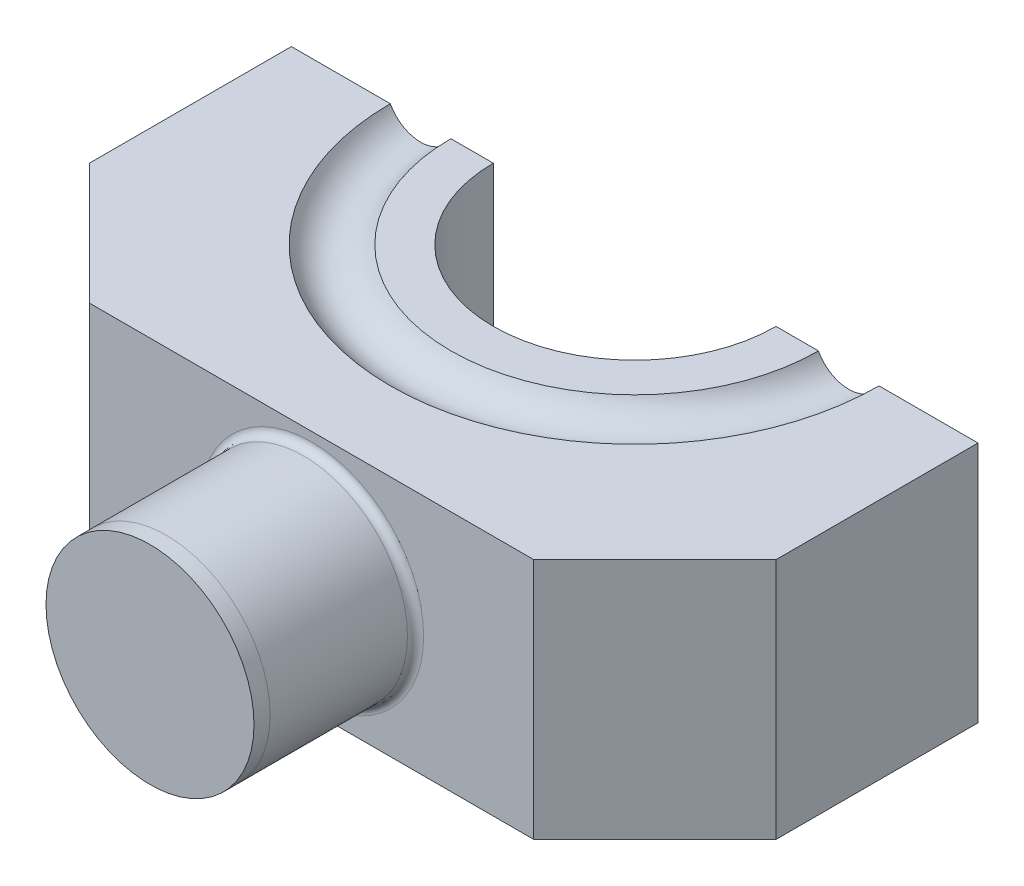
ISO-10303-21;
HEADER;
FILE_DESCRIPTION(('STEP AP214'),'2;1');
FILE_NAME('part.step','',(''),(''),'','','');
FILE_SCHEMA(('AUTOMOTIVE_DESIGN { 1 0 10303 214 1 1 1 1 }'));
ENDSEC;
DATA;
#1=APPLICATION_CONTEXT('core data for automotive mechanical design processes');
#2=APPLICATION_PROTOCOL_DEFINITION('international standard','automotive_design',2000,#1);
#3=PRODUCT_CONTEXT('',#1,'mechanical');
#4=PRODUCT('Part','Part','',(#3));
#5=PRODUCT_RELATED_PRODUCT_CATEGORY('part','',(#4));
#6=PRODUCT_DEFINITION_FORMATION('','',#4);
#7=PRODUCT_DEFINITION_CONTEXT('part definition',#1,'design');
#8=PRODUCT_DEFINITION('design','',#6,#7);
#9=PRODUCT_DEFINITION_SHAPE('','',#8);
#10=(LENGTH_UNIT() NAMED_UNIT(*) SI_UNIT(.MILLI.,.METRE.));
#11=(NAMED_UNIT(*) PLANE_ANGLE_UNIT() SI_UNIT($,.RADIAN.));
#12=(NAMED_UNIT(*) SI_UNIT($,.STERADIAN.) SOLID_ANGLE_UNIT());
#13=UNCERTAINTY_MEASURE_WITH_UNIT(LENGTH_MEASURE(1.E-05),#10,'distance_accuracy_value','');
#14=(GEOMETRIC_REPRESENTATION_CONTEXT(3) GLOBAL_UNCERTAINTY_ASSIGNED_CONTEXT((#13)) GLOBAL_UNIT_ASSIGNED_CONTEXT((#10,
#11,#12)) REPRESENTATION_CONTEXT('',''));
#15=CARTESIAN_POINT('',(0.,0.,0.));
#16=DIRECTION('',(0.,0.,1.));
#17=DIRECTION('',(1.,0.,0.));
#18=AXIS2_PLACEMENT_3D('',#15,#16,#17);
#19=CARTESIAN_POINT('',(0.,60.,240.));
#20=DIRECTION('',(0.,0.,-1.));
#21=DIRECTION('',(-1.,0.,0.));
#22=AXIS2_PLACEMENT_3D('',#19,#20,#21);
#23=CYLINDRICAL_SURFACE('',#22,51.5);
#24=CARTESIAN_POINT('',(0.,60.,164.));
#25=DIRECTION('',(0.,0.,-1.));
#26=DIRECTION('',(-1.,0.,0.));
#27=AXIS2_PLACEMENT_3D('',#24,#25,#26);
#28=CIRCLE('',#27,51.5);
#29=CARTESIAN_POINT('',(-51.5,60.,164.));
#30=VERTEX_POINT('',#29);
#31=EDGE_CURVE('E186',#30,#30,#28,.F.);
#32=ORIENTED_EDGE('',*,*,#31,.T.);
#33=EDGE_LOOP('',(#32));
#34=FACE_BOUND('',#33,.T.);
#35=CARTESIAN_POINT('',(0.,60.,232.));
#36=DIRECTION('',(0.,0.,1.));
#37=DIRECTION('',(1.,0.,0.));
#38=AXIS2_PLACEMENT_3D('',#35,#36,#37);
#39=CIRCLE('',#38,51.5);
#40=CARTESIAN_POINT('',(51.5,60.,232.));
#41=VERTEX_POINT('',#40);
#42=EDGE_CURVE('E11',#41,#41,#39,.F.);
#43=ORIENTED_EDGE('',*,*,#42,.T.);
#44=EDGE_LOOP('',(#43));
#45=FACE_BOUND('',#44,.T.);
#46=ADVANCED_FACE('F41',(#34,#45),#23,.T.);
#47=CARTESIAN_POINT('',(0.,120.,0.));
#48=DIRECTION('',(0.,1.,0.));
#49=DIRECTION('',(0.,0.,1.));
#50=AXIS2_PLACEMENT_3D('',#47,#48,#49);
#51=PLANE('',#50);
#52=DIRECTION('',(1.,0.,0.));
#53=VECTOR('',#52,1.);
#54=CARTESIAN_POINT('',(231.262306932653,120.,0.));
#55=LINE('',#54,#53);
#56=CARTESIAN_POINT('',(-170.,120.,0.));
#57=VERTEX_POINT('',#56);
#58=CARTESIAN_POINT('',(-121.,120.,0.));
#59=VERTEX_POINT('',#58);
#60=EDGE_CURVE('E65',#57,#59,#55,.T.);
#61=ORIENTED_EDGE('',*,*,#60,.F.);
#62=DIRECTION('',(0.,0.,1.));
#63=VECTOR('',#62,1.);
#64=CARTESIAN_POINT('',(-170.,120.,-100.000000000001));
#65=LINE('',#64,#63);
#66=CARTESIAN_POINT('',(-170.,120.,100.000000000001));
#67=VERTEX_POINT('',#66);
#68=EDGE_CURVE('E135',#57,#67,#65,.T.);
#69=ORIENTED_EDGE('',*,*,#68,.T.);
#70=DIRECTION('',(0.707106781186552,0.,0.707106781186544));
#71=VECTOR('',#70,1.);
#72=CARTESIAN_POINT('',(-110.,120.,160.));
#73=LINE('',#72,#71);
#74=CARTESIAN_POINT('',(-110.,120.,160.));
#75=VERTEX_POINT('',#74);
#76=EDGE_CURVE('E148',#67,#75,#73,.T.);
#77=ORIENTED_EDGE('',*,*,#76,.T.);
#78=DIRECTION('',(1.,0.,0.));
#79=VECTOR('',#78,1.);
#80=CARTESIAN_POINT('',(-110.,120.,160.));
#81=LINE('',#80,#79);
#82=CARTESIAN_POINT('',(110.,120.,160.));
#83=VERTEX_POINT('',#82);
#84=EDGE_CURVE('E151',#75,#83,#81,.T.);
#85=ORIENTED_EDGE('',*,*,#84,.T.);
#86=DIRECTION('',(0.707106781186551,0.,-0.707106781186544));
#87=VECTOR('',#86,1.);
#88=CARTESIAN_POINT('',(110.,120.,160.));
#89=LINE('',#88,#87);
#90=CARTESIAN_POINT('',(170.,120.,100.000000000001));
#91=VERTEX_POINT('',#90);
#92=EDGE_CURVE('E161',#83,#91,#89,.T.);
#93=ORIENTED_EDGE('',*,*,#92,.T.);
#94=DIRECTION('',(0.,0.,-1.));
#95=VECTOR('',#94,1.);
#96=CARTESIAN_POINT('',(170.,120.,-100.000000000001));
#97=LINE('',#96,#95);
#98=CARTESIAN_POINT('',(170.,120.,0.));
#99=VERTEX_POINT('',#98);
#100=EDGE_CURVE('E163',#91,#99,#97,.T.);
#101=ORIENTED_EDGE('',*,*,#100,.T.);
#102=CARTESIAN_POINT('',(121.,120.,0.));
#103=VERTEX_POINT('',#102);
#104=EDGE_CURVE('E143',#103,#99,#55,.T.);
#105=ORIENTED_EDGE('',*,*,#104,.F.);
#106=CARTESIAN_POINT('',(0.,120.,0.));
#107=DIRECTION('',(0.,1.,0.));
#108=DIRECTION('',(0.,0.,1.));
#109=AXIS2_PLACEMENT_3D('',#106,#107,#108);
#110=CIRCLE('',#109,121.);
#111=EDGE_CURVE('E139',#103,#59,#110,.F.);
#112=ORIENTED_EDGE('',*,*,#111,.T.);
#113=EDGE_LOOP('',(#61,#69,#77,#85,#93,#101,#105,#112));
#114=FACE_BOUND('',#113,.T.);
#115=ADVANCED_FACE('F134',(#114),#51,.T.);
#116=CARTESIAN_POINT('',(-91.,120.,0.));
#117=VERTEX_POINT('',#116);
#118=CARTESIAN_POINT('',(-70.,120.,0.));
#119=VERTEX_POINT('',#118);
#120=EDGE_CURVE('E141',#117,#119,#55,.T.);
#121=ORIENTED_EDGE('',*,*,#120,.F.);
#122=CARTESIAN_POINT('',(0.,120.,0.));
#123=DIRECTION('',(0.,-1.,0.));
#124=DIRECTION('',(0.,0.,-1.));
#125=AXIS2_PLACEMENT_3D('',#122,#123,#124);
#126=CIRCLE('',#125,91.);
#127=CARTESIAN_POINT('',(91.,120.,0.));
#128=VERTEX_POINT('',#127);
#129=EDGE_CURVE('E130',#117,#128,#126,.F.);
#130=ORIENTED_EDGE('',*,*,#129,.T.);
#131=CARTESIAN_POINT('',(70.,120.,0.));
#132=VERTEX_POINT('',#131);
#133=EDGE_CURVE('E57',#132,#128,#55,.T.);
#134=ORIENTED_EDGE('',*,*,#133,.F.);
#135=CARTESIAN_POINT('',(0.,120.,0.));
#136=DIRECTION('',(0.,1.,0.));
#137=DIRECTION('',(0.,0.,1.));
#138=AXIS2_PLACEMENT_3D('',#135,#136,#137);
#139=CIRCLE('',#138,70.);
#140=EDGE_CURVE('E157',#119,#132,#139,.T.);
#141=ORIENTED_EDGE('',*,*,#140,.F.);
#142=EDGE_LOOP('',(#121,#130,#134,#141));
#143=FACE_BOUND('',#142,.T.);
#144=ADVANCED_FACE('F210',(#143),#51,.T.);
#145=CARTESIAN_POINT('',(-170.,120.,-100.000000000001));
#146=DIRECTION('',(1.,0.,0.));
#147=DIRECTION('',(0.,0.,-1.));
#148=AXIS2_PLACEMENT_3D('',#145,#146,#147);
#149=PLANE('',#148);
#150=ORIENTED_EDGE('',*,*,#68,.F.);
#151=DIRECTION('',(0.,-1.,0.));
#152=VECTOR('',#151,1.);
#153=CARTESIAN_POINT('',(-170.,120.,0.));
#154=LINE('',#153,#152);
#155=CARTESIAN_POINT('',(-170.,0.,0.));
#156=VERTEX_POINT('',#155);
#157=EDGE_CURVE('E123',#57,#156,#154,.T.);
#158=ORIENTED_EDGE('',*,*,#157,.T.);
#159=DIRECTION('',(0.,0.,1.));
#160=VECTOR('',#159,1.);
#161=CARTESIAN_POINT('',(-170.,0.,-100.000000000001));
#162=LINE('',#161,#160);
#163=CARTESIAN_POINT('',(-170.,0.,100.000000000001));
#164=VERTEX_POINT('',#163);
#165=EDGE_CURVE('E167',#156,#164,#162,.T.);
#166=ORIENTED_EDGE('',*,*,#165,.T.);
#167=DIRECTION('',(0.,-1.,0.));
#168=VECTOR('',#167,1.);
#169=CARTESIAN_POINT('',(-170.,120.,100.000000000001));
#170=LINE('',#169,#168);
#171=EDGE_CURVE('E146',#67,#164,#170,.T.);
#172=ORIENTED_EDGE('',*,*,#171,.F.);
#173=EDGE_LOOP('',(#150,#158,#166,#172));
#174=FACE_BOUND('',#173,.T.);
#175=ADVANCED_FACE('F144',(#174),#149,.F.);
#176=CARTESIAN_POINT('',(-110.,120.,160.));
#177=DIRECTION('',(0.707106781186544,0.,-0.707106781186551));
#178=DIRECTION('',(-0.707106781186551,0.,-0.707106781186544));
#179=AXIS2_PLACEMENT_3D('',#176,#177,#178);
#180=PLANE('',#179);
#181=DIRECTION('',(0.707106781186552,0.,0.707106781186544));
#182=VECTOR('',#181,1.);
#183=CARTESIAN_POINT('',(-110.,0.,160.));
#184=LINE('',#183,#182);
#185=CARTESIAN_POINT('',(-110.,0.,160.));
#186=VERTEX_POINT('',#185);
#187=EDGE_CURVE('E169',#164,#186,#184,.T.);
#188=ORIENTED_EDGE('',*,*,#187,.T.);
#189=DIRECTION('',(0.,-1.,0.));
#190=VECTOR('',#189,1.);
#191=CARTESIAN_POINT('',(-110.,120.,160.));
#192=LINE('',#191,#190);
#193=EDGE_CURVE('E179',#75,#186,#192,.T.);
#194=ORIENTED_EDGE('',*,*,#193,.F.);
#195=ORIENTED_EDGE('',*,*,#76,.F.);
#196=ORIENTED_EDGE('',*,*,#171,.T.);
#197=EDGE_LOOP('',(#188,#194,#195,#196));
#198=FACE_BOUND('',#197,.T.);
#199=ADVANCED_FACE('F241',(#198),#180,.F.);
#200=CARTESIAN_POINT('',(-110.,120.,160.));
#201=DIRECTION('',(0.,0.,-1.));
#202=DIRECTION('',(-1.,0.,0.));
#203=AXIS2_PLACEMENT_3D('',#200,#201,#202);
#204=PLANE('',#203);
#205=CARTESIAN_POINT('',(0.,60.,160.));
#206=DIRECTION('',(0.,0.,-1.));
#207=DIRECTION('',(-1.,0.,0.));
#208=AXIS2_PLACEMENT_3D('',#205,#206,#207);
#209=CIRCLE('',#208,55.5);
#210=CARTESIAN_POINT('',(-55.5,60.,160.));
#211=VERTEX_POINT('',#210);
#212=EDGE_CURVE('E183',#211,#211,#209,.T.);
#213=ORIENTED_EDGE('',*,*,#212,.T.);
#214=EDGE_LOOP('',(#213));
#215=FACE_BOUND('',#214,.T.);
#216=DIRECTION('',(1.,0.,0.));
#217=VECTOR('',#216,1.);
#218=CARTESIAN_POINT('',(-110.,0.,160.));
#219=LINE('',#218,#217);
#220=CARTESIAN_POINT('',(110.,0.,160.));
#221=VERTEX_POINT('',#220);
#222=EDGE_CURVE('E171',#186,#221,#219,.T.);
#223=ORIENTED_EDGE('',*,*,#222,.T.);
#224=DIRECTION('',(0.,-1.,0.));
#225=VECTOR('',#224,1.);
#226=CARTESIAN_POINT('',(110.,120.,160.));
#227=LINE('',#226,#225);
#228=EDGE_CURVE('E176',#83,#221,#227,.T.);
#229=ORIENTED_EDGE('',*,*,#228,.F.);
#230=ORIENTED_EDGE('',*,*,#84,.F.);
#231=ORIENTED_EDGE('',*,*,#193,.T.);
#232=EDGE_LOOP('',(#223,#229,#230,#231));
#233=FACE_BOUND('',#232,.T.);
#234=ADVANCED_FACE('F248',(#215,#233),#204,.F.);
#235=CARTESIAN_POINT('',(110.,120.,160.));
#236=DIRECTION('',(-0.707106781186544,0.,-0.707106781186551));
#237=DIRECTION('',(-0.707106781186551,0.,0.707106781186544));
#238=AXIS2_PLACEMENT_3D('',#235,#236,#237);
#239=PLANE('',#238);
#240=DIRECTION('',(0.707106781186551,0.,-0.707106781186544));
#241=VECTOR('',#240,1.);
#242=CARTESIAN_POINT('',(110.,0.,160.));
#243=LINE('',#242,#241);
#244=CARTESIAN_POINT('',(170.,0.,100.000000000001));
#245=VERTEX_POINT('',#244);
#246=EDGE_CURVE('E154',#221,#245,#243,.T.);
#247=ORIENTED_EDGE('',*,*,#246,.T.);
#248=DIRECTION('',(0.,-1.,0.));
#249=VECTOR('',#248,1.);
#250=CARTESIAN_POINT('',(170.,120.,100.000000000001));
#251=LINE('',#250,#249);
#252=EDGE_CURVE('E166',#91,#245,#251,.T.);
#253=ORIENTED_EDGE('',*,*,#252,.F.);
#254=ORIENTED_EDGE('',*,*,#92,.F.);
#255=ORIENTED_EDGE('',*,*,#228,.T.);
#256=EDGE_LOOP('',(#247,#253,#254,#255));
#257=FACE_BOUND('',#256,.T.);
#258=ADVANCED_FACE('F251',(#257),#239,.F.);
#259=CARTESIAN_POINT('',(170.,120.,-100.000000000001));
#260=DIRECTION('',(-1.,0.,0.));
#261=DIRECTION('',(0.,0.,1.));
#262=AXIS2_PLACEMENT_3D('',#259,#260,#261);
#263=PLANE('',#262);
#264=DIRECTION('',(0.,0.,-1.));
#265=VECTOR('',#264,1.);
#266=CARTESIAN_POINT('',(170.,0.,-100.000000000001));
#267=LINE('',#266,#265);
#268=CARTESIAN_POINT('',(170.,0.,0.));
#269=VERTEX_POINT('',#268);
#270=EDGE_CURVE('E149',#245,#269,#267,.T.);
#271=ORIENTED_EDGE('',*,*,#270,.T.);
#272=DIRECTION('',(0.,1.,0.));
#273=VECTOR('',#272,1.);
#274=CARTESIAN_POINT('',(170.,120.,0.));
#275=LINE('',#274,#273);
#276=EDGE_CURVE('E219',#269,#99,#275,.T.);
#277=ORIENTED_EDGE('',*,*,#276,.T.);
#278=ORIENTED_EDGE('',*,*,#100,.F.);
#279=ORIENTED_EDGE('',*,*,#252,.T.);
#280=EDGE_LOOP('',(#271,#277,#278,#279));
#281=FACE_BOUND('',#280,.T.);
#282=ADVANCED_FACE('F253',(#281),#263,.F.);
#283=CARTESIAN_POINT('',(0.,0.,0.));
#284=DIRECTION('',(0.,1.,0.));
#285=DIRECTION('',(0.,0.,1.));
#286=AXIS2_PLACEMENT_3D('',#283,#284,#285);
#287=PLANE('',#286);
#288=ORIENTED_EDGE('',*,*,#165,.F.);
#289=DIRECTION('',(1.,0.,0.));
#290=VECTOR('',#289,1.);
#291=CARTESIAN_POINT('',(0.,0.,0.));
#292=LINE('',#291,#290);
#293=CARTESIAN_POINT('',(-75.,0.,0.));
#294=VERTEX_POINT('',#293);
#295=EDGE_CURVE('E126',#156,#294,#292,.T.);
#296=ORIENTED_EDGE('',*,*,#295,.T.);
#297=CARTESIAN_POINT('',(0.,0.,0.));
#298=DIRECTION('',(0.,1.,0.));
#299=DIRECTION('',(0.,0.,1.));
#300=AXIS2_PLACEMENT_3D('',#297,#298,#299);
#301=CIRCLE('',#300,75.0000000000001);
#302=CARTESIAN_POINT('',(75.0000000000001,0.,0.));
#303=VERTEX_POINT('',#302);
#304=EDGE_CURVE('E189',#294,#303,#301,.T.);
#305=ORIENTED_EDGE('',*,*,#304,.T.);
#306=EDGE_CURVE('E216',#303,#269,#292,.T.);
#307=ORIENTED_EDGE('',*,*,#306,.T.);
#308=ORIENTED_EDGE('',*,*,#270,.F.);
#309=ORIENTED_EDGE('',*,*,#246,.F.);
#310=ORIENTED_EDGE('',*,*,#222,.F.);
#311=ORIENTED_EDGE('',*,*,#187,.F.);
#312=EDGE_LOOP('',(#288,#296,#305,#307,#308,#309,#310,#311));
#313=FACE_BOUND('',#312,.T.);
#314=ADVANCED_FACE('F236',(#313),#287,.F.);
#315=CARTESIAN_POINT('',(0.,120.,0.));
#316=DIRECTION('',(0.,-1.,0.));
#317=DIRECTION('',(0.,0.,-1.));
#318=AXIS2_PLACEMENT_3D('',#315,#316,#317);
#319=CYLINDRICAL_SURFACE('',#318,70.);
#320=DIRECTION('',(0.,-1.,0.));
#321=VECTOR('',#320,1.);
#322=CARTESIAN_POINT('',(-70.,120.,0.));
#323=LINE('',#322,#321);
#324=CARTESIAN_POINT('',(-70.,5.00000000000006,0.));
#325=VERTEX_POINT('',#324);
#326=EDGE_CURVE('E223',#119,#325,#323,.T.);
#327=ORIENTED_EDGE('',*,*,#326,.F.);
#328=ORIENTED_EDGE('',*,*,#140,.T.);
#329=DIRECTION('',(0.,-1.,0.));
#330=VECTOR('',#329,1.);
#331=CARTESIAN_POINT('',(70.,120.,0.));
#332=LINE('',#331,#330);
#333=CARTESIAN_POINT('',(70.0000000000001,5.00000000000006,0.));
#334=VERTEX_POINT('',#333);
#335=EDGE_CURVE('E214',#334,#132,#332,.F.);
#336=ORIENTED_EDGE('',*,*,#335,.F.);
#337=CARTESIAN_POINT('',(0.,5.00000000000006,0.));
#338=DIRECTION('',(0.,1.,0.));
#339=DIRECTION('',(0.,0.,1.));
#340=AXIS2_PLACEMENT_3D('',#337,#338,#339);
#341=CIRCLE('',#340,70.);
#342=EDGE_CURVE('E192',#334,#325,#341,.F.);
#343=ORIENTED_EDGE('',*,*,#342,.T.);
#344=EDGE_LOOP('',(#327,#328,#336,#343));
#345=FACE_BOUND('',#344,.T.);
#346=ADVANCED_FACE('F229',(#345),#319,.F.);
#347=ORIENTED_EDGE('',*,*,#42,.F.);
#348=EDGE_LOOP('',(#347));
#349=FACE_BOUND('',#348,.T.);
#350=CARTESIAN_POINT('',(0.,60.,240.));
#351=DIRECTION('',(0.,0.,-1.));
#352=DIRECTION('',(-1.,0.,0.));
#353=AXIS2_PLACEMENT_3D('',#350,#351,#352);
#354=CIRCLE('',#353,51.5);
#355=CARTESIAN_POINT('',(-51.5,60.,240.));
#356=VERTEX_POINT('',#355);
#357=EDGE_CURVE('E199',#356,#356,#354,.T.);
#358=ORIENTED_EDGE('',*,*,#357,.T.);
#359=EDGE_LOOP('',(#358));
#360=FACE_BOUND('',#359,.T.);
#361=ADVANCED_FACE('F265',(#349,#360),#23,.T.);
#362=CARTESIAN_POINT('',(0.,60.,240.));
#363=DIRECTION('',(0.,0.,-1.));
#364=DIRECTION('',(-1.,0.,0.));
#365=AXIS2_PLACEMENT_3D('',#362,#363,#364);
#366=PLANE('',#365);
#367=ORIENTED_EDGE('',*,*,#357,.F.);
#368=EDGE_LOOP('',(#367));
#369=FACE_BOUND('',#368,.T.);
#370=ADVANCED_FACE('F274',(#369),#366,.F.);
#371=CARTESIAN_POINT('',(0.,60.,164.));
#372=DIRECTION('',(0.,0.,-1.));
#373=DIRECTION('',(-1.,0.,0.));
#374=AXIS2_PLACEMENT_3D('',#371,#372,#373);
#375=TOROIDAL_SURFACE('',#374,55.5,4.);
#376=ORIENTED_EDGE('',*,*,#31,.F.);
#377=EDGE_LOOP('',(#376));
#378=FACE_BOUND('',#377,.T.);
#379=ORIENTED_EDGE('',*,*,#212,.F.);
#380=EDGE_LOOP('',(#379));
#381=FACE_BOUND('',#380,.T.);
#382=ADVANCED_FACE('F280',(#378,#381),#375,.F.);
#383=CARTESIAN_POINT('',(0.,0.,0.));
#384=DIRECTION('',(0.,-1.,0.));
#385=DIRECTION('',(0.,0.,-1.));
#386=AXIS2_PLACEMENT_3D('',#383,#384,#385);
#387=CONICAL_SURFACE('',#386,75.0000000000001,0.785398163397447);
#388=DIRECTION('',(-0.707106781186547,-0.707106781186548,0.));
#389=VECTOR('',#388,1.);
#390=CARTESIAN_POINT('',(0.,75.0000000000003,0.));
#391=LINE('',#390,#389);
#392=EDGE_CURVE('E221',#325,#294,#391,.T.);
#393=ORIENTED_EDGE('',*,*,#392,.F.);
#394=ORIENTED_EDGE('',*,*,#342,.F.);
#395=DIRECTION('',(-0.707106781186547,0.707106781186548,0.));
#396=VECTOR('',#395,1.);
#397=CARTESIAN_POINT('',(0.,75.0000000000003,0.));
#398=LINE('',#397,#396);
#399=EDGE_CURVE('E140',#303,#334,#398,.T.);
#400=ORIENTED_EDGE('',*,*,#399,.F.);
#401=ORIENTED_EDGE('',*,*,#304,.F.);
#402=EDGE_LOOP('',(#393,#394,#400,#401));
#403=FACE_BOUND('',#402,.T.);
#404=ADVANCED_FACE('F43',(#403),#387,.F.);
#405=CARTESIAN_POINT('',(0.,128.,0.));
#406=DIRECTION('',(0.,1.,0.));
#407=DIRECTION('',(0.,0.,1.));
#408=AXIS2_PLACEMENT_3D('',#405,#406,#407);
#409=TOROIDAL_SURFACE('',#408,106.,17.);
#410=CARTESIAN_POINT('',(106.,128.,0.));
#411=DIRECTION('',(0.,0.,1.));
#412=DIRECTION('',(1.,0.,0.));
#413=AXIS2_PLACEMENT_3D('',#410,#411,#412);
#414=CIRCLE('',#413,17.);
#415=EDGE_CURVE('E50',#128,#103,#414,.T.);
#416=ORIENTED_EDGE('',*,*,#415,.F.);
#417=ORIENTED_EDGE('',*,*,#129,.F.);
#418=CARTESIAN_POINT('',(-106.,128.,0.));
#419=DIRECTION('',(0.,0.,1.));
#420=DIRECTION('',(1.,0.,0.));
#421=AXIS2_PLACEMENT_3D('',#418,#419,#420);
#422=CIRCLE('',#421,17.);
#423=EDGE_CURVE('E195',#59,#117,#422,.T.);
#424=ORIENTED_EDGE('',*,*,#423,.F.);
#425=ORIENTED_EDGE('',*,*,#111,.F.);
#426=EDGE_LOOP('',(#416,#417,#424,#425));
#427=FACE_BOUND('',#426,.T.);
#428=ADVANCED_FACE('F205',(#427),#409,.F.);
#429=CARTESIAN_POINT('',(231.262306932653,-1.2E-05,0.));
#430=DIRECTION('',(0.,0.,1.));
#431=DIRECTION('',(1.,0.,0.));
#432=AXIS2_PLACEMENT_3D('',#429,#430,#431);
#433=PLANE('',#432);
#434=ORIENTED_EDGE('',*,*,#60,.T.);
#435=ORIENTED_EDGE('',*,*,#423,.T.);
#436=ORIENTED_EDGE('',*,*,#120,.T.);
#437=ORIENTED_EDGE('',*,*,#326,.T.);
#438=ORIENTED_EDGE('',*,*,#392,.T.);
#439=ORIENTED_EDGE('',*,*,#295,.F.);
#440=ORIENTED_EDGE('',*,*,#157,.F.);
#441=EDGE_LOOP('',(#434,#435,#436,#437,#438,#439,#440));
#442=FACE_BOUND('',#441,.T.);
#443=ADVANCED_FACE('F124',(#442),#433,.F.);
#444=ORIENTED_EDGE('',*,*,#306,.F.);
#445=ORIENTED_EDGE('',*,*,#399,.T.);
#446=ORIENTED_EDGE('',*,*,#335,.T.);
#447=ORIENTED_EDGE('',*,*,#133,.T.);
#448=ORIENTED_EDGE('',*,*,#415,.T.);
#449=ORIENTED_EDGE('',*,*,#104,.T.);
#450=ORIENTED_EDGE('',*,*,#276,.F.);
#451=EDGE_LOOP('',(#444,#445,#446,#447,#448,#449,#450));
#452=FACE_BOUND('',#451,.T.);
#453=ADVANCED_FACE('F200',(#452),#433,.F.);
#454=CLOSED_SHELL('',(#46,#115,#144,#175,#199,#234,#258,#282,#314,#346,#361,#370,#382,#404,#428,
#443,#453));
#455=MANIFOLD_SOLID_BREP('B2',#454);
#456=ADVANCED_BREP_SHAPE_REPRESENTATION('',(#18,#455),#14);
#457=SHAPE_DEFINITION_REPRESENTATION(#9,#456);
ENDSEC;
END-ISO-10303-21;
